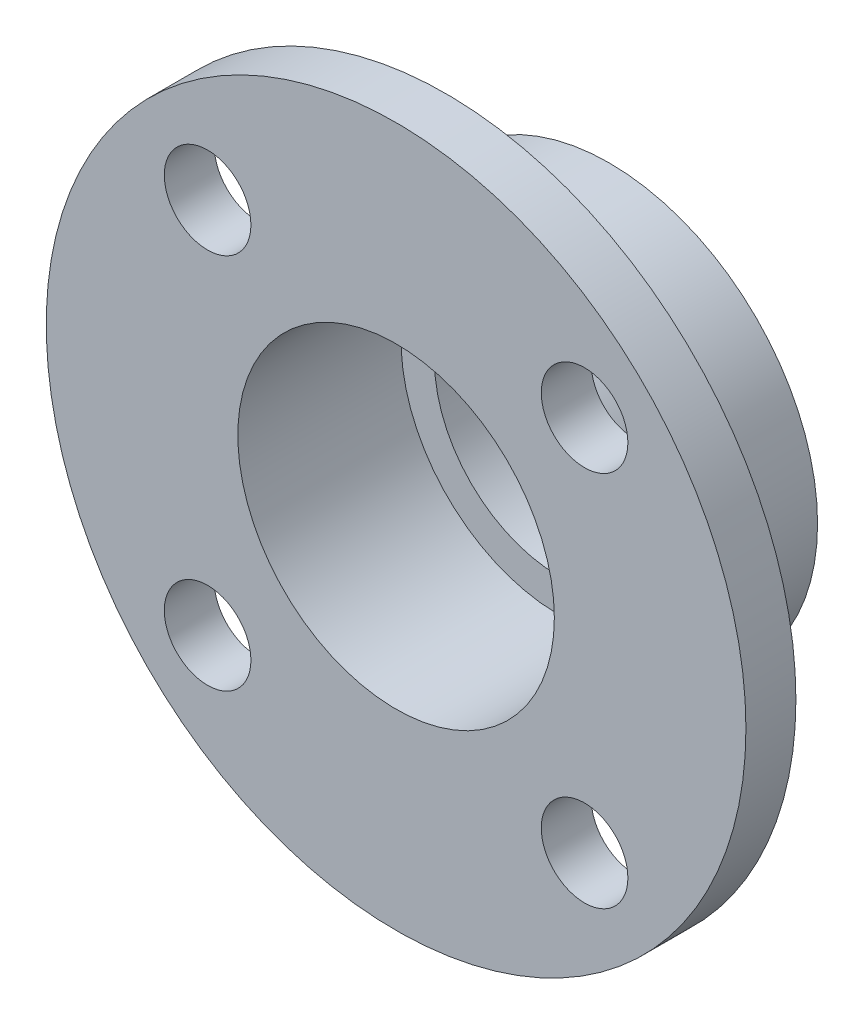
ISO-10303-21;
HEADER;
FILE_DESCRIPTION(('STEP AP214'),'2;1');
FILE_NAME('part.step','',(''),(''),'','','');
FILE_SCHEMA(('AUTOMOTIVE_DESIGN { 1 0 10303 214 1 1 1 1 }'));
ENDSEC;
DATA;
#1=APPLICATION_CONTEXT('core data for automotive mechanical design processes');
#2=APPLICATION_PROTOCOL_DEFINITION('international standard','automotive_design',2000,#1);
#3=PRODUCT_CONTEXT('',#1,'mechanical');
#4=PRODUCT('Part','Part','',(#3));
#5=PRODUCT_RELATED_PRODUCT_CATEGORY('part','',(#4));
#6=PRODUCT_DEFINITION_FORMATION('','',#4);
#7=PRODUCT_DEFINITION_CONTEXT('part definition',#1,'design');
#8=PRODUCT_DEFINITION('design','',#6,#7);
#9=PRODUCT_DEFINITION_SHAPE('','',#8);
#10=(LENGTH_UNIT() NAMED_UNIT(*) SI_UNIT(.MILLI.,.METRE.));
#11=(NAMED_UNIT(*) PLANE_ANGLE_UNIT() SI_UNIT($,.RADIAN.));
#12=(NAMED_UNIT(*) SI_UNIT($,.STERADIAN.) SOLID_ANGLE_UNIT());
#13=UNCERTAINTY_MEASURE_WITH_UNIT(LENGTH_MEASURE(1.E-05),#10,'distance_accuracy_value','');
#14=(GEOMETRIC_REPRESENTATION_CONTEXT(3) GLOBAL_UNCERTAINTY_ASSIGNED_CONTEXT((#13)) GLOBAL_UNIT_ASSIGNED_CONTEXT((#10,
#11,#12)) REPRESENTATION_CONTEXT('',''));
#15=CARTESIAN_POINT('',(0.,0.,0.));
#16=DIRECTION('',(0.,0.,1.));
#17=DIRECTION('',(1.,0.,0.));
#18=AXIS2_PLACEMENT_3D('',#15,#16,#17);
#19=CARTESIAN_POINT('',(0.,0.,0.));
#20=DIRECTION('',(0.,0.,1.));
#21=DIRECTION('',(1.,0.,0.));
#22=AXIS2_PLACEMENT_3D('',#19,#20,#21);
#23=CYLINDRICAL_SURFACE('',#22,9.5);
#24=CARTESIAN_POINT('',(0.,0.,-9.8));
#25=DIRECTION('',(0.,0.,1.));
#26=DIRECTION('',(1.,0.,0.));
#27=AXIS2_PLACEMENT_3D('',#24,#25,#26);
#28=CIRCLE('',#27,9.5);
#29=CARTESIAN_POINT('',(9.5,0.,-9.8));
#30=VERTEX_POINT('',#29);
#31=EDGE_CURVE('E61',#30,#30,#28,.T.);
#32=ORIENTED_EDGE('',*,*,#31,.F.);
#33=EDGE_LOOP('',(#32));
#34=FACE_BOUND('',#33,.T.);
#35=CARTESIAN_POINT('',(0.,0.,0.));
#36=DIRECTION('',(0.,0.,1.));
#37=DIRECTION('',(1.,0.,0.));
#38=AXIS2_PLACEMENT_3D('',#35,#36,#37);
#39=CIRCLE('',#38,9.5);
#40=CARTESIAN_POINT('',(9.5,0.,0.));
#41=VERTEX_POINT('',#40);
#42=EDGE_CURVE('E10',#41,#41,#39,.T.);
#43=ORIENTED_EDGE('',*,*,#42,.T.);
#44=EDGE_LOOP('',(#43));
#45=FACE_BOUND('',#44,.T.);
#46=ADVANCED_FACE('F33',(#34,#45),#23,.F.);
#47=CARTESIAN_POINT('',(-9.5,0.,0.));
#48=DIRECTION('',(0.,0.,-1.));
#49=DIRECTION('',(-1.,0.,0.));
#50=AXIS2_PLACEMENT_3D('',#47,#48,#49);
#51=PLANE('',#50);
#52=CARTESIAN_POINT('',(-11.3137084989848,11.3137084989847,0.));
#53=DIRECTION('',(0.,0.,1.));
#54=DIRECTION('',(0.,1.,0.));
#55=AXIS2_PLACEMENT_3D('',#52,#53,#54);
#56=CIRCLE('',#55,2.6);
#57=CARTESIAN_POINT('',(-11.3137084989848,13.9137084989847,0.));
#58=VERTEX_POINT('',#57);
#59=EDGE_CURVE('E81',#58,#58,#56,.T.);
#60=ORIENTED_EDGE('',*,*,#59,.F.);
#61=EDGE_LOOP('',(#60));
#62=FACE_BOUND('',#61,.T.);
#63=CARTESIAN_POINT('',(-11.3137084989848,-11.3137084989847,0.));
#64=DIRECTION('',(0.,0.,1.));
#65=DIRECTION('',(-1.,0.,0.));
#66=AXIS2_PLACEMENT_3D('',#63,#64,#65);
#67=CIRCLE('',#66,2.6);
#68=CARTESIAN_POINT('',(-13.9137084989848,-11.3137084989847,0.));
#69=VERTEX_POINT('',#68);
#70=EDGE_CURVE('E74',#69,#69,#67,.T.);
#71=ORIENTED_EDGE('',*,*,#70,.F.);
#72=EDGE_LOOP('',(#71));
#73=FACE_BOUND('',#72,.T.);
#74=CARTESIAN_POINT('',(11.3137084989849,-11.3137084989847,0.));
#75=DIRECTION('',(0.,0.,1.));
#76=DIRECTION('',(0.,-1.,0.));
#77=AXIS2_PLACEMENT_3D('',#74,#75,#76);
#78=CIRCLE('',#77,2.6);
#79=CARTESIAN_POINT('',(11.3137084989849,-13.9137084989847,0.));
#80=VERTEX_POINT('',#79);
#81=EDGE_CURVE('E75',#80,#80,#78,.T.);
#82=ORIENTED_EDGE('',*,*,#81,.F.);
#83=EDGE_LOOP('',(#82));
#84=FACE_BOUND('',#83,.T.);
#85=CARTESIAN_POINT('',(11.3137084989848,11.3137084989847,0.));
#86=DIRECTION('',(0.,0.,1.));
#87=DIRECTION('',(1.,0.,0.));
#88=AXIS2_PLACEMENT_3D('',#85,#86,#87);
#89=CIRCLE('',#88,2.6);
#90=CARTESIAN_POINT('',(13.9137084989848,11.3137084989847,0.));
#91=VERTEX_POINT('',#90);
#92=EDGE_CURVE('E67',#91,#91,#89,.T.);
#93=ORIENTED_EDGE('',*,*,#92,.F.);
#94=EDGE_LOOP('',(#93));
#95=FACE_BOUND('',#94,.T.);
#96=ORIENTED_EDGE('',*,*,#42,.F.);
#97=EDGE_LOOP('',(#96));
#98=FACE_BOUND('',#97,.T.);
#99=CARTESIAN_POINT('',(0.,0.,0.));
#100=DIRECTION('',(0.,0.,1.));
#101=DIRECTION('',(1.,0.,0.));
#102=AXIS2_PLACEMENT_3D('',#99,#100,#101);
#103=CIRCLE('',#102,21.);
#104=CARTESIAN_POINT('',(21.,0.,0.));
#105=VERTEX_POINT('',#104);
#106=EDGE_CURVE('E39',#105,#105,#103,.T.);
#107=ORIENTED_EDGE('',*,*,#106,.T.);
#108=EDGE_LOOP('',(#107));
#109=FACE_BOUND('',#108,.T.);
#110=ADVANCED_FACE('F91',(#62,#73,#84,#95,#98,#109),#51,.F.);
#111=CARTESIAN_POINT('',(0.,0.,0.));
#112=DIRECTION('',(0.,0.,1.));
#113=DIRECTION('',(1.,0.,0.));
#114=AXIS2_PLACEMENT_3D('',#111,#112,#113);
#115=CYLINDRICAL_SURFACE('',#114,21.);
#116=ORIENTED_EDGE('',*,*,#106,.F.);
#117=EDGE_LOOP('',(#116));
#118=FACE_BOUND('',#117,.T.);
#119=CARTESIAN_POINT('',(0.,0.,-3.));
#120=DIRECTION('',(0.,0.,1.));
#121=DIRECTION('',(1.,0.,0.));
#122=AXIS2_PLACEMENT_3D('',#119,#120,#121);
#123=CIRCLE('',#122,21.);
#124=CARTESIAN_POINT('',(21.,0.,-3.));
#125=VERTEX_POINT('',#124);
#126=EDGE_CURVE('E43',#125,#125,#123,.T.);
#127=ORIENTED_EDGE('',*,*,#126,.T.);
#128=EDGE_LOOP('',(#127));
#129=FACE_BOUND('',#128,.T.);
#130=ADVANCED_FACE('F94',(#118,#129),#115,.T.);
#131=CARTESIAN_POINT('',(-21.,0.,-3.));
#132=DIRECTION('',(0.,0.,1.));
#133=DIRECTION('',(1.,0.,0.));
#134=AXIS2_PLACEMENT_3D('',#131,#132,#133);
#135=PLANE('',#134);
#136=CARTESIAN_POINT('',(-11.3137084989848,11.3137084989847,-3.));
#137=DIRECTION('',(0.,0.,1.));
#138=DIRECTION('',(1.,0.,0.));
#139=AXIS2_PLACEMENT_3D('',#136,#137,#138);
#140=CIRCLE('',#139,2.6);
#141=CARTESIAN_POINT('',(-8.71370849898478,11.3137084989847,-3.));
#142=VERTEX_POINT('',#141);
#143=EDGE_CURVE('E70',#142,#142,#140,.F.);
#144=ORIENTED_EDGE('',*,*,#143,.F.);
#145=EDGE_LOOP('',(#144));
#146=FACE_BOUND('',#145,.T.);
#147=CARTESIAN_POINT('',(-11.3137084989848,-11.3137084989847,-3.));
#148=DIRECTION('',(0.,0.,1.));
#149=DIRECTION('',(1.,0.,0.));
#150=AXIS2_PLACEMENT_3D('',#147,#148,#149);
#151=CIRCLE('',#150,2.6);
#152=CARTESIAN_POINT('',(-8.71370849898478,-11.3137084989847,-3.));
#153=VERTEX_POINT('',#152);
#154=EDGE_CURVE('E78',#153,#153,#151,.F.);
#155=ORIENTED_EDGE('',*,*,#154,.F.);
#156=EDGE_LOOP('',(#155));
#157=FACE_BOUND('',#156,.T.);
#158=CARTESIAN_POINT('',(11.3137084989849,-11.3137084989847,-3.));
#159=DIRECTION('',(0.,0.,1.));
#160=DIRECTION('',(1.,0.,0.));
#161=AXIS2_PLACEMENT_3D('',#158,#159,#160);
#162=CIRCLE('',#161,2.6);
#163=CARTESIAN_POINT('',(13.9137084989849,-11.3137084989847,-3.));
#164=VERTEX_POINT('',#163);
#165=EDGE_CURVE('E71',#164,#164,#162,.F.);
#166=ORIENTED_EDGE('',*,*,#165,.F.);
#167=EDGE_LOOP('',(#166));
#168=FACE_BOUND('',#167,.T.);
#169=CARTESIAN_POINT('',(11.3137084989848,11.3137084989847,-3.));
#170=DIRECTION('',(0.,0.,1.));
#171=DIRECTION('',(1.,0.,0.));
#172=AXIS2_PLACEMENT_3D('',#169,#170,#171);
#173=CIRCLE('',#172,2.6);
#174=CARTESIAN_POINT('',(13.9137084989848,11.3137084989847,-3.));
#175=VERTEX_POINT('',#174);
#176=EDGE_CURVE('E64',#175,#175,#173,.F.);
#177=ORIENTED_EDGE('',*,*,#176,.F.);
#178=EDGE_LOOP('',(#177));
#179=FACE_BOUND('',#178,.T.);
#180=ORIENTED_EDGE('',*,*,#126,.F.);
#181=EDGE_LOOP('',(#180));
#182=FACE_BOUND('',#181,.T.);
#183=CARTESIAN_POINT('',(0.,0.,-3.));
#184=DIRECTION('',(0.,0.,1.));
#185=DIRECTION('',(1.,0.,0.));
#186=AXIS2_PLACEMENT_3D('',#183,#184,#185);
#187=CIRCLE('',#186,12.5);
#188=CARTESIAN_POINT('',(12.5,0.,-3.));
#189=VERTEX_POINT('',#188);
#190=EDGE_CURVE('E47',#189,#189,#187,.T.);
#191=ORIENTED_EDGE('',*,*,#190,.T.);
#192=EDGE_LOOP('',(#191));
#193=FACE_BOUND('',#192,.T.);
#194=ADVANCED_FACE('F135',(#146,#157,#168,#179,#182,#193),#135,.F.);
#195=CARTESIAN_POINT('',(0.,0.,0.));
#196=DIRECTION('',(0.,0.,1.));
#197=DIRECTION('',(1.,0.,0.));
#198=AXIS2_PLACEMENT_3D('',#195,#196,#197);
#199=CYLINDRICAL_SURFACE('',#198,12.5);
#200=ORIENTED_EDGE('',*,*,#190,.F.);
#201=EDGE_LOOP('',(#200));
#202=FACE_BOUND('',#201,.T.);
#203=CARTESIAN_POINT('',(0.,0.,-12.8));
#204=DIRECTION('',(0.,0.,1.));
#205=DIRECTION('',(1.,0.,0.));
#206=AXIS2_PLACEMENT_3D('',#203,#204,#205);
#207=CIRCLE('',#206,12.5);
#208=CARTESIAN_POINT('',(12.5,0.,-12.8));
#209=VERTEX_POINT('',#208);
#210=EDGE_CURVE('E52',#209,#209,#207,.T.);
#211=ORIENTED_EDGE('',*,*,#210,.T.);
#212=EDGE_LOOP('',(#211));
#213=FACE_BOUND('',#212,.T.);
#214=ADVANCED_FACE('F143',(#202,#213),#199,.T.);
#215=CARTESIAN_POINT('',(-12.5,0.,-12.8));
#216=DIRECTION('',(0.,0.,1.));
#217=DIRECTION('',(1.,0.,0.));
#218=AXIS2_PLACEMENT_3D('',#215,#216,#217);
#219=PLANE('',#218);
#220=ORIENTED_EDGE('',*,*,#210,.F.);
#221=EDGE_LOOP('',(#220));
#222=FACE_BOUND('',#221,.T.);
#223=CARTESIAN_POINT('',(0.,0.,-12.8));
#224=DIRECTION('',(0.,0.,1.));
#225=DIRECTION('',(1.,0.,0.));
#226=AXIS2_PLACEMENT_3D('',#223,#224,#225);
#227=CIRCLE('',#226,7.5);
#228=CARTESIAN_POINT('',(7.5,0.,-12.8));
#229=VERTEX_POINT('',#228);
#230=EDGE_CURVE('E55',#229,#229,#227,.T.);
#231=ORIENTED_EDGE('',*,*,#230,.T.);
#232=EDGE_LOOP('',(#231));
#233=FACE_BOUND('',#232,.T.);
#234=ADVANCED_FACE('F151',(#222,#233),#219,.F.);
#235=CARTESIAN_POINT('',(0.,0.,0.));
#236=DIRECTION('',(0.,0.,1.));
#237=DIRECTION('',(1.,0.,0.));
#238=AXIS2_PLACEMENT_3D('',#235,#236,#237);
#239=CYLINDRICAL_SURFACE('',#238,7.5);
#240=ORIENTED_EDGE('',*,*,#230,.F.);
#241=EDGE_LOOP('',(#240));
#242=FACE_BOUND('',#241,.T.);
#243=CARTESIAN_POINT('',(0.,0.,-9.8));
#244=DIRECTION('',(0.,0.,1.));
#245=DIRECTION('',(1.,0.,0.));
#246=AXIS2_PLACEMENT_3D('',#243,#244,#245);
#247=CIRCLE('',#246,7.5);
#248=CARTESIAN_POINT('',(7.5,0.,-9.8));
#249=VERTEX_POINT('',#248);
#250=EDGE_CURVE('E58',#249,#249,#247,.T.);
#251=ORIENTED_EDGE('',*,*,#250,.T.);
#252=EDGE_LOOP('',(#251));
#253=FACE_BOUND('',#252,.T.);
#254=ADVANCED_FACE('F115',(#242,#253),#239,.F.);
#255=CARTESIAN_POINT('',(-7.5,0.,-9.8));
#256=DIRECTION('',(0.,0.,-1.));
#257=DIRECTION('',(-1.,0.,0.));
#258=AXIS2_PLACEMENT_3D('',#255,#256,#257);
#259=PLANE('',#258);
#260=ORIENTED_EDGE('',*,*,#250,.F.);
#261=EDGE_LOOP('',(#260));
#262=FACE_BOUND('',#261,.T.);
#263=ORIENTED_EDGE('',*,*,#31,.T.);
#264=EDGE_LOOP('',(#263));
#265=FACE_BOUND('',#264,.T.);
#266=ADVANCED_FACE('F105',(#262,#265),#259,.F.);
#267=CARTESIAN_POINT('',(11.3137084989848,11.3137084989847,-10.3539105243401));
#268=DIRECTION('',(0.,0.,1.));
#269=DIRECTION('',(1.,0.,0.));
#270=AXIS2_PLACEMENT_3D('',#267,#268,#269);
#271=CYLINDRICAL_SURFACE('',#270,2.6);
#272=ORIENTED_EDGE('',*,*,#176,.T.);
#273=EDGE_LOOP('',(#272));
#274=FACE_BOUND('',#273,.T.);
#275=ORIENTED_EDGE('',*,*,#92,.T.);
#276=EDGE_LOOP('',(#275));
#277=FACE_BOUND('',#276,.T.);
#278=ADVANCED_FACE('F102',(#274,#277),#271,.F.);
#279=CARTESIAN_POINT('',(11.3137084989849,-11.3137084989847,-10.3539105243401));
#280=DIRECTION('',(0.,0.,1.));
#281=DIRECTION('',(1.,0.,0.));
#282=AXIS2_PLACEMENT_3D('',#279,#280,#281);
#283=CYLINDRICAL_SURFACE('',#282,2.6);
#284=ORIENTED_EDGE('',*,*,#165,.T.);
#285=EDGE_LOOP('',(#284));
#286=FACE_BOUND('',#285,.T.);
#287=ORIENTED_EDGE('',*,*,#81,.T.);
#288=EDGE_LOOP('',(#287));
#289=FACE_BOUND('',#288,.T.);
#290=ADVANCED_FACE('F104',(#286,#289),#283,.F.);
#291=CARTESIAN_POINT('',(-11.3137084989848,-11.3137084989847,-10.3539105243401));
#292=DIRECTION('',(0.,0.,1.));
#293=DIRECTION('',(1.,0.,0.));
#294=AXIS2_PLACEMENT_3D('',#291,#292,#293);
#295=CYLINDRICAL_SURFACE('',#294,2.6);
#296=ORIENTED_EDGE('',*,*,#154,.T.);
#297=EDGE_LOOP('',(#296));
#298=FACE_BOUND('',#297,.T.);
#299=ORIENTED_EDGE('',*,*,#70,.T.);
#300=EDGE_LOOP('',(#299));
#301=FACE_BOUND('',#300,.T.);
#302=ADVANCED_FACE('F112',(#298,#301),#295,.F.);
#303=CARTESIAN_POINT('',(-11.3137084989848,11.3137084989847,-10.3539105243401));
#304=DIRECTION('',(0.,0.,1.));
#305=DIRECTION('',(1.,0.,0.));
#306=AXIS2_PLACEMENT_3D('',#303,#304,#305);
#307=CYLINDRICAL_SURFACE('',#306,2.6);
#308=ORIENTED_EDGE('',*,*,#143,.T.);
#309=EDGE_LOOP('',(#308));
#310=FACE_BOUND('',#309,.T.);
#311=ORIENTED_EDGE('',*,*,#59,.T.);
#312=EDGE_LOOP('',(#311));
#313=FACE_BOUND('',#312,.T.);
#314=ADVANCED_FACE('F89',(#310,#313),#307,.F.);
#315=CLOSED_SHELL('',(#46,#110,#130,#194,#214,#234,#254,#266,#278,#290,#302,#314));
#316=MANIFOLD_SOLID_BREP('B2',#315);
#317=ADVANCED_BREP_SHAPE_REPRESENTATION('',(#18,#316),#14);
#318=SHAPE_DEFINITION_REPRESENTATION(#9,#317);
ENDSEC;
END-ISO-10303-21;
